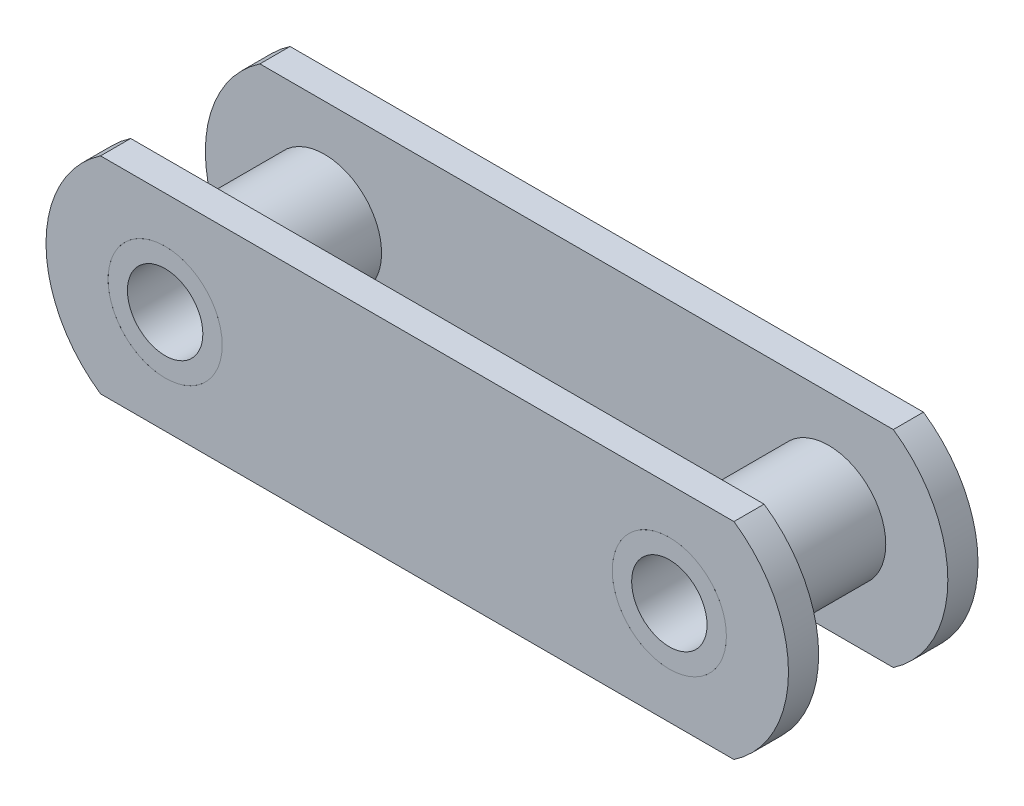
ISO-10303-21;
HEADER;
FILE_DESCRIPTION(('STEP AP214'),'2;1');
FILE_NAME('part.step','',(''),(''),'','','');
FILE_SCHEMA(('AUTOMOTIVE_DESIGN { 1 0 10303 214 1 1 1 1 }'));
ENDSEC;
DATA;
#1=APPLICATION_CONTEXT('core data for automotive mechanical design processes');
#2=APPLICATION_PROTOCOL_DEFINITION('international standard','automotive_design',2000,#1);
#3=PRODUCT_CONTEXT('',#1,'mechanical');
#4=PRODUCT('Part','Part','',(#3));
#5=PRODUCT_RELATED_PRODUCT_CATEGORY('part','',(#4));
#6=PRODUCT_DEFINITION_FORMATION('','',#4);
#7=PRODUCT_DEFINITION_CONTEXT('part definition',#1,'design');
#8=PRODUCT_DEFINITION('design','',#6,#7);
#9=PRODUCT_DEFINITION_SHAPE('','',#8);
#10=(LENGTH_UNIT() NAMED_UNIT(*) SI_UNIT(.MILLI.,.METRE.));
#11=(NAMED_UNIT(*) PLANE_ANGLE_UNIT() SI_UNIT($,.RADIAN.));
#12=(NAMED_UNIT(*) SI_UNIT($,.STERADIAN.) SOLID_ANGLE_UNIT());
#13=UNCERTAINTY_MEASURE_WITH_UNIT(LENGTH_MEASURE(1.E-05),#10,'distance_accuracy_value','');
#14=(GEOMETRIC_REPRESENTATION_CONTEXT(3) GLOBAL_UNCERTAINTY_ASSIGNED_CONTEXT((#13)) GLOBAL_UNIT_ASSIGNED_CONTEXT((#10,
#11,#12)) REPRESENTATION_CONTEXT('',''));
#15=CARTESIAN_POINT('',(0.,0.,0.));
#16=DIRECTION('',(0.,0.,1.));
#17=DIRECTION('',(1.,0.,0.));
#18=AXIS2_PLACEMENT_3D('',#15,#16,#17);
#19=CARTESIAN_POINT('',(50.15,0.,50.9526478658693));
#20=DIRECTION('',(0.,0.,-1.));
#21=DIRECTION('',(1.,0.,0.));
#22=AXIS2_PLACEMENT_3D('',#19,#20,#21);
#23=CYLINDRICAL_SURFACE('',#22,11.35);
#24=CARTESIAN_POINT('',(50.15,0.,18.85));
#25=DIRECTION('',(0.,0.,-1.));
#26=DIRECTION('',(-1.,0.,0.));
#27=AXIS2_PLACEMENT_3D('',#24,#25,#26);
#28=CIRCLE('',#27,11.35);
#29=CARTESIAN_POINT('',(38.8,0.,18.85));
#30=VERTEX_POINT('',#29);
#31=EDGE_CURVE('E11',#30,#30,#28,.T.);
#32=ORIENTED_EDGE('',*,*,#31,.T.);
#33=EDGE_LOOP('',(#32));
#34=FACE_BOUND('',#33,.T.);
#35=CARTESIAN_POINT('',(50.15,0.,-18.85));
#36=DIRECTION('',(0.,0.,1.));
#37=DIRECTION('',(1.,0.,0.));
#38=AXIS2_PLACEMENT_3D('',#35,#36,#37);
#39=CIRCLE('',#38,11.35);
#40=CARTESIAN_POINT('',(61.5,0.,-18.85));
#41=VERTEX_POINT('',#40);
#42=EDGE_CURVE('E55',#41,#41,#39,.F.);
#43=ORIENTED_EDGE('',*,*,#42,.F.);
#44=EDGE_LOOP('',(#43));
#45=FACE_BOUND('',#44,.T.);
#46=ADVANCED_FACE('F43',(#34,#45),#23,.T.);
#47=CARTESIAN_POINT('',(50.15,0.,50.9526478658693));
#48=DIRECTION('',(0.,0.,-1.));
#49=DIRECTION('',(1.,0.,0.));
#50=AXIS2_PLACEMENT_3D('',#47,#48,#49);
#51=CYLINDRICAL_SURFACE('',#50,7.5);
#52=CARTESIAN_POINT('',(50.15,0.,18.85));
#53=DIRECTION('',(0.,0.,-1.));
#54=DIRECTION('',(-1.,0.,0.));
#55=AXIS2_PLACEMENT_3D('',#52,#53,#54);
#56=CIRCLE('',#55,7.5);
#57=CARTESIAN_POINT('',(42.65,0.,18.85));
#58=VERTEX_POINT('',#57);
#59=EDGE_CURVE('E46',#58,#58,#56,.T.);
#60=ORIENTED_EDGE('',*,*,#59,.F.);
#61=EDGE_LOOP('',(#60));
#62=FACE_BOUND('',#61,.T.);
#63=CARTESIAN_POINT('',(50.15,0.,-18.85));
#64=DIRECTION('',(0.,0.,1.));
#65=DIRECTION('',(1.,0.,0.));
#66=AXIS2_PLACEMENT_3D('',#63,#64,#65);
#67=CIRCLE('',#66,7.5);
#68=CARTESIAN_POINT('',(57.65,0.,-18.85));
#69=VERTEX_POINT('',#68);
#70=EDGE_CURVE('E53',#69,#69,#67,.F.);
#71=ORIENTED_EDGE('',*,*,#70,.T.);
#72=EDGE_LOOP('',(#71));
#73=FACE_BOUND('',#72,.T.);
#74=ADVANCED_FACE('F61',(#62,#73),#51,.F.);
#75=CARTESIAN_POINT('',(49.0586405529954,0.,18.85));
#76=DIRECTION('',(0.,0.,1.));
#77=DIRECTION('',(-1.,0.,0.));
#78=AXIS2_PLACEMENT_3D('',#75,#76,#77);
#79=PLANE('',#78);
#80=ORIENTED_EDGE('',*,*,#59,.T.);
#81=EDGE_LOOP('',(#80));
#82=FACE_BOUND('',#81,.T.);
#83=ORIENTED_EDGE('',*,*,#31,.F.);
#84=EDGE_LOOP('',(#83));
#85=FACE_BOUND('',#84,.T.);
#86=ADVANCED_FACE('F65',(#82,#85),#79,.T.);
#87=CARTESIAN_POINT('',(49.0586405529954,0.,-18.85));
#88=DIRECTION('',(0.,0.,-1.));
#89=DIRECTION('',(-1.,0.,0.));
#90=AXIS2_PLACEMENT_3D('',#87,#88,#89);
#91=PLANE('',#90);
#92=ORIENTED_EDGE('',*,*,#42,.T.);
#93=EDGE_LOOP('',(#92));
#94=FACE_BOUND('',#93,.T.);
#95=ORIENTED_EDGE('',*,*,#70,.F.);
#96=EDGE_LOOP('',(#95));
#97=FACE_BOUND('',#96,.T.);
#98=ADVANCED_FACE('F63',(#94,#97),#91,.T.);
#99=CLOSED_SHELL('',(#46,#74,#86,#98));
#100=MANIFOLD_SOLID_BREP('B2',#99);
#101=CARTESIAN_POINT('',(-50.15,0.,50.9526478658693));
#102=DIRECTION('',(0.,0.,-1.));
#103=DIRECTION('',(-1.,0.,0.));
#104=AXIS2_PLACEMENT_3D('',#101,#102,#103);
#105=CYLINDRICAL_SURFACE('',#104,11.35);
#106=CARTESIAN_POINT('',(-50.15,0.,18.85));
#107=DIRECTION('',(0.,0.,1.));
#108=DIRECTION('',(1.,0.,0.));
#109=AXIS2_PLACEMENT_3D('',#106,#107,#108);
#110=CIRCLE('',#109,11.35);
#111=CARTESIAN_POINT('',(-38.8,0.,18.85));
#112=VERTEX_POINT('',#111);
#113=EDGE_CURVE('E42',#112,#112,#110,.T.);
#114=ORIENTED_EDGE('',*,*,#113,.F.);
#115=EDGE_LOOP('',(#114));
#116=FACE_BOUND('',#115,.T.);
#117=CARTESIAN_POINT('',(-50.15,0.,-18.85));
#118=DIRECTION('',(0.,0.,-1.));
#119=DIRECTION('',(-1.,0.,0.));
#120=AXIS2_PLACEMENT_3D('',#117,#118,#119);
#121=CIRCLE('',#120,11.35);
#122=CARTESIAN_POINT('',(-61.5,0.,-18.85));
#123=VERTEX_POINT('',#122);
#124=EDGE_CURVE('E126',#123,#123,#121,.F.);
#125=ORIENTED_EDGE('',*,*,#124,.T.);
#126=EDGE_LOOP('',(#125));
#127=FACE_BOUND('',#126,.T.);
#128=ADVANCED_FACE('F114',(#116,#127),#105,.T.);
#129=CARTESIAN_POINT('',(-50.15,0.,50.9526478658693));
#130=DIRECTION('',(0.,0.,-1.));
#131=DIRECTION('',(-1.,0.,0.));
#132=AXIS2_PLACEMENT_3D('',#129,#130,#131);
#133=CYLINDRICAL_SURFACE('',#132,7.5);
#134=CARTESIAN_POINT('',(-50.15,0.,18.85));
#135=DIRECTION('',(0.,0.,1.));
#136=DIRECTION('',(1.,0.,0.));
#137=AXIS2_PLACEMENT_3D('',#134,#135,#136);
#138=CIRCLE('',#137,7.5);
#139=CARTESIAN_POINT('',(-42.65,0.,18.85));
#140=VERTEX_POINT('',#139);
#141=EDGE_CURVE('E117',#140,#140,#138,.T.);
#142=ORIENTED_EDGE('',*,*,#141,.T.);
#143=EDGE_LOOP('',(#142));
#144=FACE_BOUND('',#143,.T.);
#145=CARTESIAN_POINT('',(-50.15,0.,-18.85));
#146=DIRECTION('',(0.,0.,-1.));
#147=DIRECTION('',(-1.,0.,0.));
#148=AXIS2_PLACEMENT_3D('',#145,#146,#147);
#149=CIRCLE('',#148,7.5);
#150=CARTESIAN_POINT('',(-57.65,0.,-18.85));
#151=VERTEX_POINT('',#150);
#152=EDGE_CURVE('E124',#151,#151,#149,.F.);
#153=ORIENTED_EDGE('',*,*,#152,.F.);
#154=EDGE_LOOP('',(#153));
#155=FACE_BOUND('',#154,.T.);
#156=ADVANCED_FACE('F134',(#144,#155),#133,.F.);
#157=CARTESIAN_POINT('',(-49.0586405529954,0.,18.85));
#158=DIRECTION('',(0.,0.,1.));
#159=DIRECTION('',(1.,0.,0.));
#160=AXIS2_PLACEMENT_3D('',#157,#158,#159);
#161=PLANE('',#160);
#162=ORIENTED_EDGE('',*,*,#141,.F.);
#163=EDGE_LOOP('',(#162));
#164=FACE_BOUND('',#163,.T.);
#165=ORIENTED_EDGE('',*,*,#113,.T.);
#166=EDGE_LOOP('',(#165));
#167=FACE_BOUND('',#166,.T.);
#168=ADVANCED_FACE('F136',(#164,#167),#161,.T.);
#169=CARTESIAN_POINT('',(-49.0586405529954,0.,-18.85));
#170=DIRECTION('',(0.,0.,-1.));
#171=DIRECTION('',(1.,0.,0.));
#172=AXIS2_PLACEMENT_3D('',#169,#170,#171);
#173=PLANE('',#172);
#174=ORIENTED_EDGE('',*,*,#124,.F.);
#175=EDGE_LOOP('',(#174));
#176=FACE_BOUND('',#175,.T.);
#177=ORIENTED_EDGE('',*,*,#152,.T.);
#178=EDGE_LOOP('',(#177));
#179=FACE_BOUND('',#178,.T.);
#180=ADVANCED_FACE('F132',(#176,#179),#173,.T.);
#181=CLOSED_SHELL('',(#128,#156,#168,#180));
#182=MANIFOLD_SOLID_BREP('B6',#181);
#183=CARTESIAN_POINT('',(-49.0586405529954,0.,-12.85));
#184=DIRECTION('',(0.,0.,-1.));
#185=DIRECTION('',(1.,0.,0.));
#186=AXIS2_PLACEMENT_3D('',#183,#184,#185);
#187=CYLINDRICAL_SURFACE('',#186,24.7913594470046);
#188=CARTESIAN_POINT('',(-49.0586405529954,0.,-18.85));
#189=DIRECTION('',(0.,0.,1.));
#190=DIRECTION('',(1.,0.,0.));
#191=AXIS2_PLACEMENT_3D('',#188,#189,#190);
#192=CIRCLE('',#191,24.7913594470046);
#193=CARTESIAN_POINT('',(-63.,20.5,-18.85));
#194=VERTEX_POINT('',#193);
#195=CARTESIAN_POINT('',(-63.,-20.5,-18.85));
#196=VERTEX_POINT('',#195);
#197=EDGE_CURVE('E249',#194,#196,#192,.T.);
#198=ORIENTED_EDGE('',*,*,#197,.T.);
#199=DIRECTION('',(0.,0.,-1.));
#200=VECTOR('',#199,1.);
#201=CARTESIAN_POINT('',(-63.,-20.5,-12.85));
#202=LINE('',#201,#200);
#203=CARTESIAN_POINT('',(-63.,-20.5,-12.85));
#204=VERTEX_POINT('',#203);
#205=EDGE_CURVE('E188',#204,#196,#202,.T.);
#206=ORIENTED_EDGE('',*,*,#205,.F.);
#207=CARTESIAN_POINT('',(-49.0586405529954,0.,-12.85));
#208=DIRECTION('',(0.,0.,1.));
#209=DIRECTION('',(1.,0.,0.));
#210=AXIS2_PLACEMENT_3D('',#207,#208,#209);
#211=CIRCLE('',#210,24.7913594470046);
#212=CARTESIAN_POINT('',(-63.,20.5,-12.85));
#213=VERTEX_POINT('',#212);
#214=EDGE_CURVE('E238',#213,#204,#211,.T.);
#215=ORIENTED_EDGE('',*,*,#214,.F.);
#216=DIRECTION('',(0.,0.,-1.));
#217=VECTOR('',#216,1.);
#218=CARTESIAN_POINT('',(-63.,20.5,-12.85));
#219=LINE('',#218,#217);
#220=EDGE_CURVE('E112',#213,#194,#219,.T.);
#221=ORIENTED_EDGE('',*,*,#220,.T.);
#222=EDGE_LOOP('',(#198,#206,#215,#221));
#223=FACE_BOUND('',#222,.T.);
#224=ADVANCED_FACE('F185',(#223),#187,.T.);
#225=CARTESIAN_POINT('',(-63.,20.5,-12.85));
#226=DIRECTION('',(0.,1.,0.));
#227=DIRECTION('',(0.,0.,-1.));
#228=AXIS2_PLACEMENT_3D('',#225,#226,#227);
#229=PLANE('',#228);
#230=DIRECTION('',(-1.,0.,0.));
#231=VECTOR('',#230,1.);
#232=CARTESIAN_POINT('',(-63.,20.5,-18.85));
#233=LINE('',#232,#231);
#234=CARTESIAN_POINT('',(63.,20.5,-18.85));
#235=VERTEX_POINT('',#234);
#236=EDGE_CURVE('E226',#235,#194,#233,.T.);
#237=ORIENTED_EDGE('',*,*,#236,.T.);
#238=ORIENTED_EDGE('',*,*,#220,.F.);
#239=DIRECTION('',(-1.,0.,0.));
#240=VECTOR('',#239,1.);
#241=CARTESIAN_POINT('',(-63.,20.5,-12.85));
#242=LINE('',#241,#240);
#243=CARTESIAN_POINT('',(63.,20.5,-12.85));
#244=VERTEX_POINT('',#243);
#245=EDGE_CURVE('E203',#244,#213,#242,.T.);
#246=ORIENTED_EDGE('',*,*,#245,.F.);
#247=DIRECTION('',(0.,0.,-1.));
#248=VECTOR('',#247,1.);
#249=CARTESIAN_POINT('',(63.,20.5,-12.85));
#250=LINE('',#249,#248);
#251=EDGE_CURVE('E194',#244,#235,#250,.T.);
#252=ORIENTED_EDGE('',*,*,#251,.T.);
#253=EDGE_LOOP('',(#237,#238,#246,#252));
#254=FACE_BOUND('',#253,.T.);
#255=ADVANCED_FACE('F256',(#254),#229,.T.);
#256=CARTESIAN_POINT('',(49.0586405529954,0.,-12.85));
#257=DIRECTION('',(0.,0.,-1.));
#258=DIRECTION('',(1.,0.,0.));
#259=AXIS2_PLACEMENT_3D('',#256,#257,#258);
#260=CYLINDRICAL_SURFACE('',#259,24.7913594470046);
#261=CARTESIAN_POINT('',(49.0586405529954,0.,-18.85));
#262=DIRECTION('',(0.,0.,1.));
#263=DIRECTION('',(-1.,0.,0.));
#264=AXIS2_PLACEMENT_3D('',#261,#262,#263);
#265=CIRCLE('',#264,24.7913594470046);
#266=CARTESIAN_POINT('',(63.,-20.5,-18.85));
#267=VERTEX_POINT('',#266);
#268=EDGE_CURVE('E220',#267,#235,#265,.T.);
#269=ORIENTED_EDGE('',*,*,#268,.T.);
#270=ORIENTED_EDGE('',*,*,#251,.F.);
#271=CARTESIAN_POINT('',(49.0586405529954,0.,-12.85));
#272=DIRECTION('',(0.,0.,1.));
#273=DIRECTION('',(-1.,0.,0.));
#274=AXIS2_PLACEMENT_3D('',#271,#272,#273);
#275=CIRCLE('',#274,24.7913594470046);
#276=CARTESIAN_POINT('',(63.,-20.5,-12.85));
#277=VERTEX_POINT('',#276);
#278=EDGE_CURVE('E236',#277,#244,#275,.T.);
#279=ORIENTED_EDGE('',*,*,#278,.F.);
#280=DIRECTION('',(0.,0.,-1.));
#281=VECTOR('',#280,1.);
#282=CARTESIAN_POINT('',(63.,-20.5,-12.85));
#283=LINE('',#282,#281);
#284=EDGE_CURVE('E241',#277,#267,#283,.T.);
#285=ORIENTED_EDGE('',*,*,#284,.T.);
#286=EDGE_LOOP('',(#269,#270,#279,#285));
#287=FACE_BOUND('',#286,.T.);
#288=ADVANCED_FACE('F244',(#287),#260,.T.);
#289=CARTESIAN_POINT('',(-63.,-20.5,-12.85));
#290=DIRECTION('',(0.,-1.,0.));
#291=DIRECTION('',(0.,0.,1.));
#292=AXIS2_PLACEMENT_3D('',#289,#290,#291);
#293=PLANE('',#292);
#294=DIRECTION('',(1.,0.,0.));
#295=VECTOR('',#294,1.);
#296=CARTESIAN_POINT('',(-63.,-20.5,-18.85));
#297=LINE('',#296,#295);
#298=EDGE_CURVE('E243',#196,#267,#297,.T.);
#299=ORIENTED_EDGE('',*,*,#298,.T.);
#300=ORIENTED_EDGE('',*,*,#284,.F.);
#301=DIRECTION('',(1.,0.,0.));
#302=VECTOR('',#301,1.);
#303=CARTESIAN_POINT('',(-63.,-20.5,-12.85));
#304=LINE('',#303,#302);
#305=EDGE_CURVE('E233',#204,#277,#304,.T.);
#306=ORIENTED_EDGE('',*,*,#305,.F.);
#307=ORIENTED_EDGE('',*,*,#205,.T.);
#308=EDGE_LOOP('',(#299,#300,#306,#307));
#309=FACE_BOUND('',#308,.T.);
#310=ADVANCED_FACE('F242',(#309),#293,.T.);
#311=CARTESIAN_POINT('',(-49.0586405529954,0.,-12.85));
#312=DIRECTION('',(0.,0.,-1.));
#313=DIRECTION('',(1.,0.,0.));
#314=AXIS2_PLACEMENT_3D('',#311,#312,#313);
#315=PLANE('',#314);
#316=CARTESIAN_POINT('',(-50.15,0.,-12.85));
#317=DIRECTION('',(0.,0.,-1.));
#318=DIRECTION('',(-1.,0.,0.));
#319=AXIS2_PLACEMENT_3D('',#316,#317,#318);
#320=CIRCLE('',#319,11.35);
#321=CARTESIAN_POINT('',(-61.5,0.,-12.85));
#322=VERTEX_POINT('',#321);
#323=EDGE_CURVE('E252',#322,#322,#320,.T.);
#324=ORIENTED_EDGE('',*,*,#323,.T.);
#325=EDGE_LOOP('',(#324));
#326=FACE_BOUND('',#325,.T.);
#327=CARTESIAN_POINT('',(50.15,0.,-12.85));
#328=DIRECTION('',(0.,0.,-1.));
#329=DIRECTION('',(-1.,0.,0.));
#330=AXIS2_PLACEMENT_3D('',#327,#328,#329);
#331=CIRCLE('',#330,11.35);
#332=CARTESIAN_POINT('',(38.8,0.,-12.85));
#333=VERTEX_POINT('',#332);
#334=EDGE_CURVE('E264',#333,#333,#331,.T.);
#335=ORIENTED_EDGE('',*,*,#334,.T.);
#336=EDGE_LOOP('',(#335));
#337=FACE_BOUND('',#336,.T.);
#338=ORIENTED_EDGE('',*,*,#214,.T.);
#339=ORIENTED_EDGE('',*,*,#305,.T.);
#340=ORIENTED_EDGE('',*,*,#278,.T.);
#341=ORIENTED_EDGE('',*,*,#245,.T.);
#342=EDGE_LOOP('',(#338,#339,#340,#341));
#343=FACE_BOUND('',#342,.T.);
#344=ADVANCED_FACE('F234',(#326,#337,#343),#315,.F.);
#345=CARTESIAN_POINT('',(-49.0586405529954,0.,-18.85));
#346=DIRECTION('',(0.,0.,-1.));
#347=DIRECTION('',(1.,0.,0.));
#348=AXIS2_PLACEMENT_3D('',#345,#346,#347);
#349=PLANE('',#348);
#350=CARTESIAN_POINT('',(-50.15,0.,-18.85));
#351=DIRECTION('',(0.,0.,1.));
#352=DIRECTION('',(1.,0.,0.));
#353=AXIS2_PLACEMENT_3D('',#350,#351,#352);
#354=CIRCLE('',#353,11.35);
#355=CARTESIAN_POINT('',(-38.8,0.,-18.85));
#356=VERTEX_POINT('',#355);
#357=EDGE_CURVE('E267',#356,#356,#354,.T.);
#358=ORIENTED_EDGE('',*,*,#357,.T.);
#359=EDGE_LOOP('',(#358));
#360=FACE_BOUND('',#359,.T.);
#361=CARTESIAN_POINT('',(50.15,0.,-18.85));
#362=DIRECTION('',(0.,0.,1.));
#363=DIRECTION('',(1.,0.,0.));
#364=AXIS2_PLACEMENT_3D('',#361,#362,#363);
#365=CIRCLE('',#364,11.35);
#366=CARTESIAN_POINT('',(61.5,0.,-18.85));
#367=VERTEX_POINT('',#366);
#368=EDGE_CURVE('E268',#367,#367,#365,.T.);
#369=ORIENTED_EDGE('',*,*,#368,.T.);
#370=EDGE_LOOP('',(#369));
#371=FACE_BOUND('',#370,.T.);
#372=ORIENTED_EDGE('',*,*,#197,.F.);
#373=ORIENTED_EDGE('',*,*,#236,.F.);
#374=ORIENTED_EDGE('',*,*,#268,.F.);
#375=ORIENTED_EDGE('',*,*,#298,.F.);
#376=EDGE_LOOP('',(#372,#373,#374,#375));
#377=FACE_BOUND('',#376,.T.);
#378=ADVANCED_FACE('F259',(#360,#371,#377),#349,.T.);
#379=CARTESIAN_POINT('',(50.15,0.,-18.85));
#380=DIRECTION('',(0.,0.,1.));
#381=DIRECTION('',(1.,0.,0.));
#382=AXIS2_PLACEMENT_3D('',#379,#380,#381);
#383=CYLINDRICAL_SURFACE('',#382,11.35);
#384=ORIENTED_EDGE('',*,*,#368,.F.);
#385=EDGE_LOOP('',(#384));
#386=FACE_BOUND('',#385,.T.);
#387=ORIENTED_EDGE('',*,*,#334,.F.);
#388=EDGE_LOOP('',(#387));
#389=FACE_BOUND('',#388,.T.);
#390=ADVANCED_FACE('F279',(#386,#389),#383,.F.);
#391=CARTESIAN_POINT('',(-50.15,0.,-18.85));
#392=DIRECTION('',(0.,0.,1.));
#393=DIRECTION('',(1.,0.,0.));
#394=AXIS2_PLACEMENT_3D('',#391,#392,#393);
#395=CYLINDRICAL_SURFACE('',#394,11.35);
#396=ORIENTED_EDGE('',*,*,#357,.F.);
#397=EDGE_LOOP('',(#396));
#398=FACE_BOUND('',#397,.T.);
#399=ORIENTED_EDGE('',*,*,#323,.F.);
#400=EDGE_LOOP('',(#399));
#401=FACE_BOUND('',#400,.T.);
#402=ADVANCED_FACE('F276',(#398,#401),#395,.F.);
#403=CLOSED_SHELL('',(#224,#255,#288,#310,#344,#378,#390,#402));
#404=MANIFOLD_SOLID_BREP('B37',#403);
#405=CARTESIAN_POINT('',(-49.0586405529954,0.,12.85));
#406=DIRECTION('',(0.,0.,1.));
#407=DIRECTION('',(1.,0.,0.));
#408=AXIS2_PLACEMENT_3D('',#405,#406,#407);
#409=CYLINDRICAL_SURFACE('',#408,24.7913594470046);
#410=CARTESIAN_POINT('',(-49.0586405529954,0.,18.85));
#411=DIRECTION('',(0.,0.,1.));
#412=DIRECTION('',(1.,0.,0.));
#413=AXIS2_PLACEMENT_3D('',#410,#411,#412);
#414=CIRCLE('',#413,24.7913594470046);
#415=CARTESIAN_POINT('',(-63.,20.5,18.85));
#416=VERTEX_POINT('',#415);
#417=CARTESIAN_POINT('',(-63.,-20.5,18.85));
#418=VERTEX_POINT('',#417);
#419=EDGE_CURVE('E415',#416,#418,#414,.T.);
#420=ORIENTED_EDGE('',*,*,#419,.F.);
#421=DIRECTION('',(0.,0.,1.));
#422=VECTOR('',#421,1.);
#423=CARTESIAN_POINT('',(-63.,20.5,12.85));
#424=LINE('',#423,#422);
#425=CARTESIAN_POINT('',(-63.,20.5,12.85));
#426=VERTEX_POINT('',#425);
#427=EDGE_CURVE('E183',#426,#416,#424,.T.);
#428=ORIENTED_EDGE('',*,*,#427,.F.);
#429=CARTESIAN_POINT('',(-49.0586405529954,0.,12.85));
#430=DIRECTION('',(0.,0.,1.));
#431=DIRECTION('',(1.,0.,0.));
#432=AXIS2_PLACEMENT_3D('',#429,#430,#431);
#433=CIRCLE('',#432,24.7913594470046);
#434=CARTESIAN_POINT('',(-63.,-20.5,12.85));
#435=VERTEX_POINT('',#434);
#436=EDGE_CURVE('E408',#426,#435,#433,.T.);
#437=ORIENTED_EDGE('',*,*,#436,.T.);
#438=DIRECTION('',(0.,0.,1.));
#439=VECTOR('',#438,1.);
#440=CARTESIAN_POINT('',(-63.,-20.5,12.85));
#441=LINE('',#440,#439);
#442=EDGE_CURVE('E353',#435,#418,#441,.T.);
#443=ORIENTED_EDGE('',*,*,#442,.T.);
#444=EDGE_LOOP('',(#420,#428,#437,#443));
#445=FACE_BOUND('',#444,.T.);
#446=ADVANCED_FACE('F350',(#445),#409,.T.);
#447=CARTESIAN_POINT('',(-63.,20.5,12.85));
#448=DIRECTION('',(0.,1.,0.));
#449=DIRECTION('',(0.,0.,1.));
#450=AXIS2_PLACEMENT_3D('',#447,#448,#449);
#451=PLANE('',#450);
#452=DIRECTION('',(-1.,0.,0.));
#453=VECTOR('',#452,1.);
#454=CARTESIAN_POINT('',(-63.,20.5,18.85));
#455=LINE('',#454,#453);
#456=CARTESIAN_POINT('',(63.,20.5,18.85));
#457=VERTEX_POINT('',#456);
#458=EDGE_CURVE('E410',#457,#416,#455,.T.);
#459=ORIENTED_EDGE('',*,*,#458,.F.);
#460=DIRECTION('',(0.,0.,1.));
#461=VECTOR('',#460,1.);
#462=CARTESIAN_POINT('',(63.,20.5,12.85));
#463=LINE('',#462,#461);
#464=CARTESIAN_POINT('',(63.,20.5,12.85));
#465=VERTEX_POINT('',#464);
#466=EDGE_CURVE('E359',#465,#457,#463,.T.);
#467=ORIENTED_EDGE('',*,*,#466,.F.);
#468=DIRECTION('',(-1.,0.,0.));
#469=VECTOR('',#468,1.);
#470=CARTESIAN_POINT('',(-63.,20.5,12.85));
#471=LINE('',#470,#469);
#472=EDGE_CURVE('E405',#465,#426,#471,.T.);
#473=ORIENTED_EDGE('',*,*,#472,.T.);
#474=ORIENTED_EDGE('',*,*,#427,.T.);
#475=EDGE_LOOP('',(#459,#467,#473,#474));
#476=FACE_BOUND('',#475,.T.);
#477=ADVANCED_FACE('F426',(#476),#451,.T.);
#478=CARTESIAN_POINT('',(49.0586405529954,0.,12.85));
#479=DIRECTION('',(0.,0.,1.));
#480=DIRECTION('',(1.,0.,0.));
#481=AXIS2_PLACEMENT_3D('',#478,#479,#480);
#482=CYLINDRICAL_SURFACE('',#481,24.7913594470046);
#483=CARTESIAN_POINT('',(49.0586405529954,0.,18.85));
#484=DIRECTION('',(0.,0.,1.));
#485=DIRECTION('',(-1.,0.,0.));
#486=AXIS2_PLACEMENT_3D('',#483,#484,#485);
#487=CIRCLE('',#486,24.7913594470046);
#488=CARTESIAN_POINT('',(63.,-20.5,18.85));
#489=VERTEX_POINT('',#488);
#490=EDGE_CURVE('E400',#489,#457,#487,.T.);
#491=ORIENTED_EDGE('',*,*,#490,.F.);
#492=DIRECTION('',(0.,0.,1.));
#493=VECTOR('',#492,1.);
#494=CARTESIAN_POINT('',(63.,-20.5,12.85));
#495=LINE('',#494,#493);
#496=CARTESIAN_POINT('',(63.,-20.5,12.85));
#497=VERTEX_POINT('',#496);
#498=EDGE_CURVE('E395',#497,#489,#495,.T.);
#499=ORIENTED_EDGE('',*,*,#498,.F.);
#500=CARTESIAN_POINT('',(49.0586405529954,0.,12.85));
#501=DIRECTION('',(0.,0.,1.));
#502=DIRECTION('',(-1.,0.,0.));
#503=AXIS2_PLACEMENT_3D('',#500,#501,#502);
#504=CIRCLE('',#503,24.7913594470046);
#505=EDGE_CURVE('E398',#497,#465,#504,.T.);
#506=ORIENTED_EDGE('',*,*,#505,.T.);
#507=ORIENTED_EDGE('',*,*,#466,.T.);
#508=EDGE_LOOP('',(#491,#499,#506,#507));
#509=FACE_BOUND('',#508,.T.);
#510=ADVANCED_FACE('F397',(#509),#482,.T.);
#511=CARTESIAN_POINT('',(-63.,-20.5,12.85));
#512=DIRECTION('',(0.,-1.,0.));
#513=DIRECTION('',(0.,0.,-1.));
#514=AXIS2_PLACEMENT_3D('',#511,#512,#513);
#515=PLANE('',#514);
#516=DIRECTION('',(1.,0.,0.));
#517=VECTOR('',#516,1.);
#518=CARTESIAN_POINT('',(-63.,-20.5,18.85));
#519=LINE('',#518,#517);
#520=EDGE_CURVE('E418',#418,#489,#519,.T.);
#521=ORIENTED_EDGE('',*,*,#520,.F.);
#522=ORIENTED_EDGE('',*,*,#442,.F.);
#523=DIRECTION('',(1.,0.,0.));
#524=VECTOR('',#523,1.);
#525=CARTESIAN_POINT('',(-63.,-20.5,12.85));
#526=LINE('',#525,#524);
#527=EDGE_CURVE('E404',#435,#497,#526,.T.);
#528=ORIENTED_EDGE('',*,*,#527,.T.);
#529=ORIENTED_EDGE('',*,*,#498,.T.);
#530=EDGE_LOOP('',(#521,#522,#528,#529));
#531=FACE_BOUND('',#530,.T.);
#532=ADVANCED_FACE('F407',(#531),#515,.T.);
#533=CARTESIAN_POINT('',(-49.0586405529954,0.,12.85));
#534=DIRECTION('',(0.,0.,1.));
#535=DIRECTION('',(1.,0.,0.));
#536=AXIS2_PLACEMENT_3D('',#533,#534,#535);
#537=PLANE('',#536);
#538=CARTESIAN_POINT('',(-50.15,0.,12.85));
#539=DIRECTION('',(0.,0.,1.));
#540=DIRECTION('',(1.,0.,0.));
#541=AXIS2_PLACEMENT_3D('',#538,#539,#540);
#542=CIRCLE('',#541,11.35);
#543=CARTESIAN_POINT('',(-38.8,0.,12.85));
#544=VERTEX_POINT('',#543);
#545=EDGE_CURVE('E419',#544,#544,#542,.T.);
#546=ORIENTED_EDGE('',*,*,#545,.T.);
#547=EDGE_LOOP('',(#546));
#548=FACE_BOUND('',#547,.T.);
#549=CARTESIAN_POINT('',(50.15,0.,12.85));
#550=DIRECTION('',(0.,0.,1.));
#551=DIRECTION('',(1.,0.,0.));
#552=AXIS2_PLACEMENT_3D('',#549,#550,#551);
#553=CIRCLE('',#552,11.35);
#554=CARTESIAN_POINT('',(61.5,0.,12.85));
#555=VERTEX_POINT('',#554);
#556=EDGE_CURVE('E462',#555,#555,#553,.T.);
#557=ORIENTED_EDGE('',*,*,#556,.T.);
#558=EDGE_LOOP('',(#557));
#559=FACE_BOUND('',#558,.T.);
#560=ORIENTED_EDGE('',*,*,#436,.F.);
#561=ORIENTED_EDGE('',*,*,#472,.F.);
#562=ORIENTED_EDGE('',*,*,#505,.F.);
#563=ORIENTED_EDGE('',*,*,#527,.F.);
#564=EDGE_LOOP('',(#560,#561,#562,#563));
#565=FACE_BOUND('',#564,.T.);
#566=ADVANCED_FACE('F403',(#548,#559,#565),#537,.F.);
#567=CARTESIAN_POINT('',(-49.0586405529954,0.,18.85));
#568=DIRECTION('',(0.,0.,1.));
#569=DIRECTION('',(1.,0.,0.));
#570=AXIS2_PLACEMENT_3D('',#567,#568,#569);
#571=PLANE('',#570);
#572=CARTESIAN_POINT('',(-50.15,0.,18.85));
#573=DIRECTION('',(0.,0.,1.));
#574=DIRECTION('',(1.,0.,0.));
#575=AXIS2_PLACEMENT_3D('',#572,#573,#574);
#576=CIRCLE('',#575,11.35);
#577=CARTESIAN_POINT('',(-38.8,0.,18.85));
#578=VERTEX_POINT('',#577);
#579=EDGE_CURVE('E460',#578,#578,#576,.T.);
#580=ORIENTED_EDGE('',*,*,#579,.F.);
#581=EDGE_LOOP('',(#580));
#582=FACE_BOUND('',#581,.T.);
#583=CARTESIAN_POINT('',(50.15,0.,18.85));
#584=DIRECTION('',(0.,0.,1.));
#585=DIRECTION('',(1.,0.,0.));
#586=AXIS2_PLACEMENT_3D('',#583,#584,#585);
#587=CIRCLE('',#586,11.35);
#588=CARTESIAN_POINT('',(61.5,0.,18.85));
#589=VERTEX_POINT('',#588);
#590=EDGE_CURVE('E466',#589,#589,#587,.T.);
#591=ORIENTED_EDGE('',*,*,#590,.F.);
#592=EDGE_LOOP('',(#591));
#593=FACE_BOUND('',#592,.T.);
#594=ORIENTED_EDGE('',*,*,#419,.T.);
#595=ORIENTED_EDGE('',*,*,#520,.T.);
#596=ORIENTED_EDGE('',*,*,#490,.T.);
#597=ORIENTED_EDGE('',*,*,#458,.T.);
#598=EDGE_LOOP('',(#594,#595,#596,#597));
#599=FACE_BOUND('',#598,.T.);
#600=ADVANCED_FACE('F425',(#582,#593,#599),#571,.T.);
#601=CARTESIAN_POINT('',(50.15,0.,-18.85));
#602=DIRECTION('',(0.,0.,1.));
#603=DIRECTION('',(1.,0.,0.));
#604=AXIS2_PLACEMENT_3D('',#601,#602,#603);
#605=CYLINDRICAL_SURFACE('',#604,11.35);
#606=ORIENTED_EDGE('',*,*,#590,.T.);
#607=EDGE_LOOP('',(#606));
#608=FACE_BOUND('',#607,.T.);
#609=ORIENTED_EDGE('',*,*,#556,.F.);
#610=EDGE_LOOP('',(#609));
#611=FACE_BOUND('',#610,.T.);
#612=ADVANCED_FACE('F444',(#608,#611),#605,.F.);
#613=CARTESIAN_POINT('',(-50.15,0.,-18.85));
#614=DIRECTION('',(0.,0.,1.));
#615=DIRECTION('',(1.,0.,0.));
#616=AXIS2_PLACEMENT_3D('',#613,#614,#615);
#617=CYLINDRICAL_SURFACE('',#616,11.35);
#618=ORIENTED_EDGE('',*,*,#579,.T.);
#619=EDGE_LOOP('',(#618));
#620=FACE_BOUND('',#619,.T.);
#621=ORIENTED_EDGE('',*,*,#545,.F.);
#622=EDGE_LOOP('',(#621));
#623=FACE_BOUND('',#622,.T.);
#624=ADVANCED_FACE('F451',(#620,#623),#617,.F.);
#625=CLOSED_SHELL('',(#446,#477,#510,#532,#566,#600,#612,#624));
#626=MANIFOLD_SOLID_BREP('B106',#625);
#627=ADVANCED_BREP_SHAPE_REPRESENTATION('',(#18,#100,#182,#404,#626),#14);
#628=SHAPE_DEFINITION_REPRESENTATION(#9,#627);
ENDSEC;
END-ISO-10303-21;
